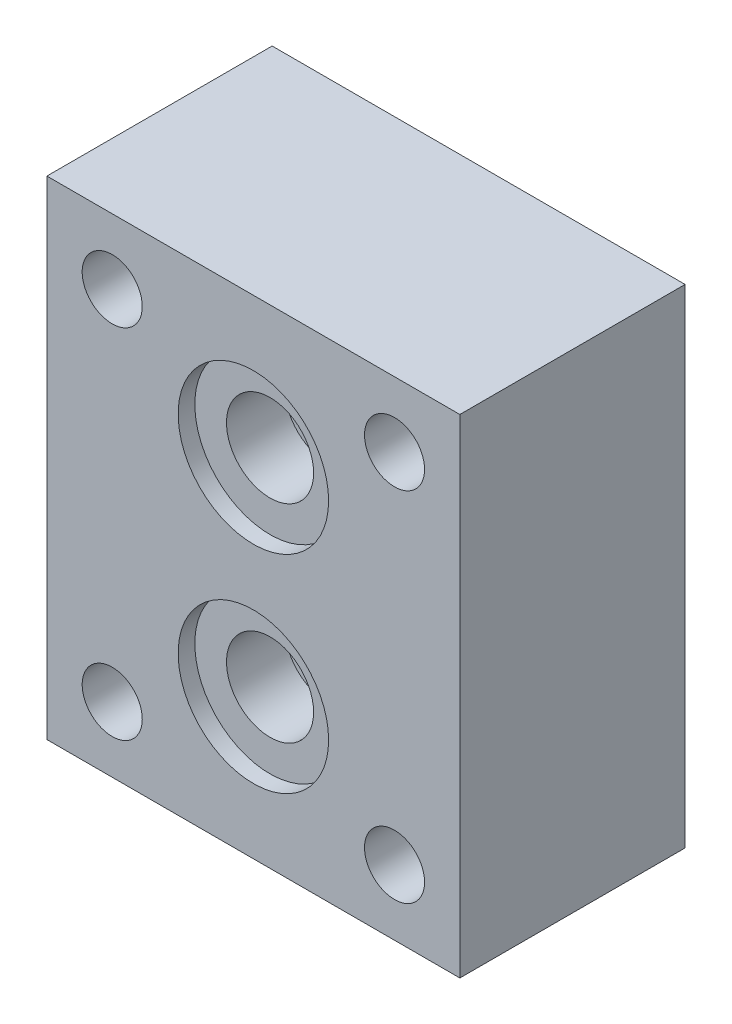
ISO-10303-21;
HEADER;
FILE_DESCRIPTION(('STEP AP214'),'2;1');
FILE_NAME('part.step','',(''),(''),'','','');
FILE_SCHEMA(('AUTOMOTIVE_DESIGN { 1 0 10303 214 1 1 1 1 }'));
ENDSEC;
DATA;
#1=APPLICATION_CONTEXT('core data for automotive mechanical design processes');
#2=APPLICATION_PROTOCOL_DEFINITION('international standard','automotive_design',2000,#1);
#3=PRODUCT_CONTEXT('',#1,'mechanical');
#4=PRODUCT('Part','Part','',(#3));
#5=PRODUCT_RELATED_PRODUCT_CATEGORY('part','',(#4));
#6=PRODUCT_DEFINITION_FORMATION('','',#4);
#7=PRODUCT_DEFINITION_CONTEXT('part definition',#1,'design');
#8=PRODUCT_DEFINITION('design','',#6,#7);
#9=PRODUCT_DEFINITION_SHAPE('','',#8);
#10=(LENGTH_UNIT() NAMED_UNIT(*) SI_UNIT(.MILLI.,.METRE.));
#11=(NAMED_UNIT(*) PLANE_ANGLE_UNIT() SI_UNIT($,.RADIAN.));
#12=(NAMED_UNIT(*) SI_UNIT($,.STERADIAN.) SOLID_ANGLE_UNIT());
#13=UNCERTAINTY_MEASURE_WITH_UNIT(LENGTH_MEASURE(1.E-05),#10,'distance_accuracy_value','');
#14=(GEOMETRIC_REPRESENTATION_CONTEXT(3) GLOBAL_UNCERTAINTY_ASSIGNED_CONTEXT((#13)) GLOBAL_UNIT_ASSIGNED_CONTEXT((#10,
#11,#12)) REPRESENTATION_CONTEXT('',''));
#15=CARTESIAN_POINT('',(0.,0.,0.));
#16=DIRECTION('',(0.,0.,1.));
#17=DIRECTION('',(1.,0.,0.));
#18=AXIS2_PLACEMENT_3D('',#15,#16,#17);
#19=CARTESIAN_POINT('',(34.925,41.275,19.05));
#20=DIRECTION('',(0.,-1.,0.));
#21=DIRECTION('',(0.,0.,-1.));
#22=AXIS2_PLACEMENT_3D('',#19,#20,#21);
#23=PLANE('',#22);
#24=DIRECTION('',(-1.,0.,0.));
#25=VECTOR('',#24,1.);
#26=CARTESIAN_POINT('',(34.925,41.275,-19.05));
#27=LINE('',#26,#25);
#28=CARTESIAN_POINT('',(34.925,41.275,-19.05));
#29=VERTEX_POINT('',#28);
#30=CARTESIAN_POINT('',(-34.925,41.275,-19.05));
#31=VERTEX_POINT('',#30);
#32=EDGE_CURVE('E109',#29,#31,#27,.T.);
#33=ORIENTED_EDGE('',*,*,#32,.T.);
#34=DIRECTION('',(0.,0.,-1.));
#35=VECTOR('',#34,1.);
#36=CARTESIAN_POINT('',(-34.925,41.275,19.05));
#37=LINE('',#36,#35);
#38=CARTESIAN_POINT('',(-34.925,41.275,19.05));
#39=VERTEX_POINT('',#38);
#40=EDGE_CURVE('E11',#39,#31,#37,.T.);
#41=ORIENTED_EDGE('',*,*,#40,.F.);
#42=DIRECTION('',(-1.,0.,0.));
#43=VECTOR('',#42,1.);
#44=CARTESIAN_POINT('',(34.925,41.275,19.05));
#45=LINE('',#44,#43);
#46=CARTESIAN_POINT('',(34.925,41.275,19.05));
#47=VERTEX_POINT('',#46);
#48=EDGE_CURVE('E96',#47,#39,#45,.T.);
#49=ORIENTED_EDGE('',*,*,#48,.F.);
#50=DIRECTION('',(0.,0.,-1.));
#51=VECTOR('',#50,1.);
#52=CARTESIAN_POINT('',(34.925,41.275,19.05));
#53=LINE('',#52,#51);
#54=EDGE_CURVE('E105',#47,#29,#53,.T.);
#55=ORIENTED_EDGE('',*,*,#54,.T.);
#56=EDGE_LOOP('',(#33,#41,#49,#55));
#57=FACE_BOUND('',#56,.T.);
#58=ADVANCED_FACE('F43',(#57),#23,.F.);
#59=CARTESIAN_POINT('',(-34.925,-41.275,19.05));
#60=DIRECTION('',(1.,0.,0.));
#61=DIRECTION('',(0.,0.,-1.));
#62=AXIS2_PLACEMENT_3D('',#59,#60,#61);
#63=PLANE('',#62);
#64=DIRECTION('',(0.,-1.,0.));
#65=VECTOR('',#64,1.);
#66=CARTESIAN_POINT('',(-34.925,-41.275,-19.05));
#67=LINE('',#66,#65);
#68=CARTESIAN_POINT('',(-34.925,-41.275,-19.05));
#69=VERTEX_POINT('',#68);
#70=EDGE_CURVE('E100',#31,#69,#67,.T.);
#71=ORIENTED_EDGE('',*,*,#70,.T.);
#72=DIRECTION('',(0.,0.,-1.));
#73=VECTOR('',#72,1.);
#74=CARTESIAN_POINT('',(-34.925,-41.275,19.05));
#75=LINE('',#74,#73);
#76=CARTESIAN_POINT('',(-34.925,-41.275,19.05));
#77=VERTEX_POINT('',#76);
#78=EDGE_CURVE('E52',#77,#69,#75,.T.);
#79=ORIENTED_EDGE('',*,*,#78,.F.);
#80=DIRECTION('',(0.,-1.,0.));
#81=VECTOR('',#80,1.);
#82=CARTESIAN_POINT('',(-34.925,-41.275,19.05));
#83=LINE('',#82,#81);
#84=EDGE_CURVE('E91',#39,#77,#83,.T.);
#85=ORIENTED_EDGE('',*,*,#84,.F.);
#86=ORIENTED_EDGE('',*,*,#40,.T.);
#87=EDGE_LOOP('',(#71,#79,#85,#86));
#88=FACE_BOUND('',#87,.T.);
#89=ADVANCED_FACE('F99',(#88),#63,.F.);
#90=CARTESIAN_POINT('',(34.925,-41.275,19.05));
#91=DIRECTION('',(0.,1.,0.));
#92=DIRECTION('',(0.,0.,1.));
#93=AXIS2_PLACEMENT_3D('',#90,#91,#92);
#94=PLANE('',#93);
#95=DIRECTION('',(1.,0.,0.));
#96=VECTOR('',#95,1.);
#97=CARTESIAN_POINT('',(34.925,-41.275,-19.05));
#98=LINE('',#97,#96);
#99=CARTESIAN_POINT('',(34.925,-41.275,-19.05));
#100=VERTEX_POINT('',#99);
#101=EDGE_CURVE('E78',#69,#100,#98,.T.);
#102=ORIENTED_EDGE('',*,*,#101,.T.);
#103=DIRECTION('',(0.,0.,-1.));
#104=VECTOR('',#103,1.);
#105=CARTESIAN_POINT('',(34.925,-41.275,19.05));
#106=LINE('',#105,#104);
#107=CARTESIAN_POINT('',(34.925,-41.275,19.05));
#108=VERTEX_POINT('',#107);
#109=EDGE_CURVE('E101',#108,#100,#106,.T.);
#110=ORIENTED_EDGE('',*,*,#109,.F.);
#111=DIRECTION('',(1.,0.,0.));
#112=VECTOR('',#111,1.);
#113=CARTESIAN_POINT('',(34.925,-41.275,19.05));
#114=LINE('',#113,#112);
#115=EDGE_CURVE('E94',#77,#108,#114,.T.);
#116=ORIENTED_EDGE('',*,*,#115,.F.);
#117=ORIENTED_EDGE('',*,*,#78,.T.);
#118=EDGE_LOOP('',(#102,#110,#116,#117));
#119=FACE_BOUND('',#118,.T.);
#120=ADVANCED_FACE('F103',(#119),#94,.F.);
#121=CARTESIAN_POINT('',(34.925,-41.275,19.05));
#122=DIRECTION('',(-1.,0.,0.));
#123=DIRECTION('',(0.,0.,1.));
#124=AXIS2_PLACEMENT_3D('',#121,#122,#123);
#125=PLANE('',#124);
#126=DIRECTION('',(0.,1.,0.));
#127=VECTOR('',#126,1.);
#128=CARTESIAN_POINT('',(34.925,-41.275,-19.05));
#129=LINE('',#128,#127);
#130=EDGE_CURVE('E84',#100,#29,#129,.T.);
#131=ORIENTED_EDGE('',*,*,#130,.T.);
#132=ORIENTED_EDGE('',*,*,#54,.F.);
#133=DIRECTION('',(0.,1.,0.));
#134=VECTOR('',#133,1.);
#135=CARTESIAN_POINT('',(34.925,-41.275,19.05));
#136=LINE('',#135,#134);
#137=EDGE_CURVE('E61',#108,#47,#136,.T.);
#138=ORIENTED_EDGE('',*,*,#137,.F.);
#139=ORIENTED_EDGE('',*,*,#109,.T.);
#140=EDGE_LOOP('',(#131,#132,#138,#139));
#141=FACE_BOUND('',#140,.T.);
#142=ADVANCED_FACE('F164',(#141),#125,.F.);
#143=CARTESIAN_POINT('',(0.,0.,19.05));
#144=DIRECTION('',(0.,0.,-1.));
#145=DIRECTION('',(-1.,0.,0.));
#146=AXIS2_PLACEMENT_3D('',#143,#144,#145);
#147=PLANE('',#146);
#148=CARTESIAN_POINT('',(0.,17.526,19.05));
#149=DIRECTION('',(0.,0.,1.));
#150=DIRECTION('',(1.,0.,0.));
#151=AXIS2_PLACEMENT_3D('',#148,#149,#150);
#152=CIRCLE('',#151,12.7254);
#153=CARTESIAN_POINT('',(12.7254,17.526,19.05));
#154=VERTEX_POINT('',#153);
#155=EDGE_CURVE('E316',#154,#154,#152,.T.);
#156=ORIENTED_EDGE('',*,*,#155,.F.);
#157=EDGE_LOOP('',(#156));
#158=FACE_BOUND('',#157,.T.);
#159=CARTESIAN_POINT('',(0.,-17.526,19.05));
#160=DIRECTION('',(0.,0.,1.));
#161=DIRECTION('',(1.,0.,0.));
#162=AXIS2_PLACEMENT_3D('',#159,#160,#161);
#163=CIRCLE('',#162,12.7254);
#164=CARTESIAN_POINT('',(12.7254,-17.526,19.05));
#165=VERTEX_POINT('',#164);
#166=EDGE_CURVE('E127',#165,#165,#163,.T.);
#167=ORIENTED_EDGE('',*,*,#166,.F.);
#168=EDGE_LOOP('',(#167));
#169=FACE_BOUND('',#168,.T.);
#170=CARTESIAN_POINT('',(23.876,30.226,19.05));
#171=DIRECTION('',(0.,0.,1.));
#172=DIRECTION('',(1.,0.,0.));
#173=AXIS2_PLACEMENT_3D('',#170,#171,#172);
#174=CIRCLE('',#173,5.08);
#175=CARTESIAN_POINT('',(28.956,30.226,19.05));
#176=VERTEX_POINT('',#175);
#177=EDGE_CURVE('E141',#176,#176,#174,.T.);
#178=ORIENTED_EDGE('',*,*,#177,.F.);
#179=EDGE_LOOP('',(#178));
#180=FACE_BOUND('',#179,.T.);
#181=CARTESIAN_POINT('',(-23.876,-30.226,19.05));
#182=DIRECTION('',(0.,0.,1.));
#183=DIRECTION('',(1.,0.,0.));
#184=AXIS2_PLACEMENT_3D('',#181,#182,#183);
#185=CIRCLE('',#184,5.08);
#186=CARTESIAN_POINT('',(-18.796,-30.226,19.05));
#187=VERTEX_POINT('',#186);
#188=EDGE_CURVE('E144',#187,#187,#185,.T.);
#189=ORIENTED_EDGE('',*,*,#188,.F.);
#190=EDGE_LOOP('',(#189));
#191=FACE_BOUND('',#190,.T.);
#192=CARTESIAN_POINT('',(-23.876,30.226,19.05));
#193=DIRECTION('',(0.,0.,1.));
#194=DIRECTION('',(1.,0.,0.));
#195=AXIS2_PLACEMENT_3D('',#192,#193,#194);
#196=CIRCLE('',#195,5.08);
#197=CARTESIAN_POINT('',(-18.796,30.226,19.05));
#198=VERTEX_POINT('',#197);
#199=EDGE_CURVE('E150',#198,#198,#196,.T.);
#200=ORIENTED_EDGE('',*,*,#199,.F.);
#201=EDGE_LOOP('',(#200));
#202=FACE_BOUND('',#201,.T.);
#203=CARTESIAN_POINT('',(23.876,-30.226,19.05));
#204=DIRECTION('',(0.,0.,1.));
#205=DIRECTION('',(1.,0.,0.));
#206=AXIS2_PLACEMENT_3D('',#203,#204,#205);
#207=CIRCLE('',#206,5.08);
#208=CARTESIAN_POINT('',(28.956,-30.226,19.05));
#209=VERTEX_POINT('',#208);
#210=EDGE_CURVE('E140',#209,#209,#207,.T.);
#211=ORIENTED_EDGE('',*,*,#210,.F.);
#212=EDGE_LOOP('',(#211));
#213=FACE_BOUND('',#212,.T.);
#214=ORIENTED_EDGE('',*,*,#48,.T.);
#215=ORIENTED_EDGE('',*,*,#84,.T.);
#216=ORIENTED_EDGE('',*,*,#115,.T.);
#217=ORIENTED_EDGE('',*,*,#137,.T.);
#218=EDGE_LOOP('',(#214,#215,#216,#217));
#219=FACE_BOUND('',#218,.T.);
#220=ADVANCED_FACE('F92',(#158,#169,#180,#191,#202,#213,#219),#147,.F.);
#221=CARTESIAN_POINT('',(0.,0.,-19.05));
#222=DIRECTION('',(0.,0.,-1.));
#223=DIRECTION('',(-1.,0.,0.));
#224=AXIS2_PLACEMENT_3D('',#221,#222,#223);
#225=PLANE('',#224);
#226=CARTESIAN_POINT('',(23.876,30.226,-19.05));
#227=DIRECTION('',(0.,0.,1.));
#228=DIRECTION('',(1.,0.,0.));
#229=AXIS2_PLACEMENT_3D('',#226,#227,#228);
#230=CIRCLE('',#229,5.08);
#231=CARTESIAN_POINT('',(28.956,30.226,-19.05));
#232=VERTEX_POINT('',#231);
#233=EDGE_CURVE('E137',#232,#232,#230,.T.);
#234=ORIENTED_EDGE('',*,*,#233,.T.);
#235=EDGE_LOOP('',(#234));
#236=FACE_BOUND('',#235,.T.);
#237=CARTESIAN_POINT('',(-23.876,-30.226,-19.05));
#238=DIRECTION('',(0.,0.,1.));
#239=DIRECTION('',(1.,0.,0.));
#240=AXIS2_PLACEMENT_3D('',#237,#238,#239);
#241=CIRCLE('',#240,5.08);
#242=CARTESIAN_POINT('',(-18.796,-30.226,-19.05));
#243=VERTEX_POINT('',#242);
#244=EDGE_CURVE('E147',#243,#243,#241,.T.);
#245=ORIENTED_EDGE('',*,*,#244,.T.);
#246=EDGE_LOOP('',(#245));
#247=FACE_BOUND('',#246,.T.);
#248=CARTESIAN_POINT('',(-23.876,30.226,-19.05));
#249=DIRECTION('',(0.,0.,1.));
#250=DIRECTION('',(1.,0.,0.));
#251=AXIS2_PLACEMENT_3D('',#248,#249,#250);
#252=CIRCLE('',#251,5.08);
#253=CARTESIAN_POINT('',(-18.796,30.226,-19.05));
#254=VERTEX_POINT('',#253);
#255=EDGE_CURVE('E124',#254,#254,#252,.T.);
#256=ORIENTED_EDGE('',*,*,#255,.T.);
#257=EDGE_LOOP('',(#256));
#258=FACE_BOUND('',#257,.T.);
#259=CARTESIAN_POINT('',(23.876,-30.226,-19.05));
#260=DIRECTION('',(0.,0.,1.));
#261=DIRECTION('',(1.,0.,0.));
#262=AXIS2_PLACEMENT_3D('',#259,#260,#261);
#263=CIRCLE('',#262,5.08);
#264=CARTESIAN_POINT('',(28.956,-30.226,-19.05));
#265=VERTEX_POINT('',#264);
#266=EDGE_CURVE('E112',#265,#265,#263,.T.);
#267=ORIENTED_EDGE('',*,*,#266,.T.);
#268=EDGE_LOOP('',(#267));
#269=FACE_BOUND('',#268,.T.);
#270=ORIENTED_EDGE('',*,*,#32,.F.);
#271=ORIENTED_EDGE('',*,*,#130,.F.);
#272=ORIENTED_EDGE('',*,*,#101,.F.);
#273=ORIENTED_EDGE('',*,*,#70,.F.);
#274=EDGE_LOOP('',(#270,#271,#272,#273));
#275=FACE_BOUND('',#274,.T.);
#276=ADVANCED_FACE('F163',(#236,#247,#258,#269,#275),#225,.T.);
#277=CARTESIAN_POINT('',(23.876,-30.226,-19.05));
#278=DIRECTION('',(0.,0.,1.));
#279=DIRECTION('',(1.,0.,0.));
#280=AXIS2_PLACEMENT_3D('',#277,#278,#279);
#281=CYLINDRICAL_SURFACE('',#280,5.08);
#282=ORIENTED_EDGE('',*,*,#266,.F.);
#283=EDGE_LOOP('',(#282));
#284=FACE_BOUND('',#283,.T.);
#285=ORIENTED_EDGE('',*,*,#210,.T.);
#286=EDGE_LOOP('',(#285));
#287=FACE_BOUND('',#286,.T.);
#288=ADVANCED_FACE('F160',(#284,#287),#281,.F.);
#289=CARTESIAN_POINT('',(-23.876,30.226,-19.05));
#290=DIRECTION('',(0.,0.,1.));
#291=DIRECTION('',(1.,0.,0.));
#292=AXIS2_PLACEMENT_3D('',#289,#290,#291);
#293=CYLINDRICAL_SURFACE('',#292,5.08);
#294=ORIENTED_EDGE('',*,*,#255,.F.);
#295=EDGE_LOOP('',(#294));
#296=FACE_BOUND('',#295,.T.);
#297=ORIENTED_EDGE('',*,*,#199,.T.);
#298=EDGE_LOOP('',(#297));
#299=FACE_BOUND('',#298,.T.);
#300=ADVANCED_FACE('F203',(#296,#299),#293,.F.);
#301=CARTESIAN_POINT('',(-23.876,-30.226,-19.05));
#302=DIRECTION('',(0.,0.,1.));
#303=DIRECTION('',(1.,0.,0.));
#304=AXIS2_PLACEMENT_3D('',#301,#302,#303);
#305=CYLINDRICAL_SURFACE('',#304,5.08);
#306=ORIENTED_EDGE('',*,*,#244,.F.);
#307=EDGE_LOOP('',(#306));
#308=FACE_BOUND('',#307,.T.);
#309=ORIENTED_EDGE('',*,*,#188,.T.);
#310=EDGE_LOOP('',(#309));
#311=FACE_BOUND('',#310,.T.);
#312=ADVANCED_FACE('F217',(#308,#311),#305,.F.);
#313=CARTESIAN_POINT('',(23.876,30.226,-19.05));
#314=DIRECTION('',(0.,0.,1.));
#315=DIRECTION('',(1.,0.,0.));
#316=AXIS2_PLACEMENT_3D('',#313,#314,#315);
#317=CYLINDRICAL_SURFACE('',#316,5.08);
#318=ORIENTED_EDGE('',*,*,#233,.F.);
#319=EDGE_LOOP('',(#318));
#320=FACE_BOUND('',#319,.T.);
#321=ORIENTED_EDGE('',*,*,#177,.T.);
#322=EDGE_LOOP('',(#321));
#323=FACE_BOUND('',#322,.T.);
#324=ADVANCED_FACE('F226',(#320,#323),#317,.F.);
#325=CARTESIAN_POINT('',(0.,-17.526,16.2306));
#326=DIRECTION('',(0.,0.,1.));
#327=DIRECTION('',(1.,0.,0.));
#328=AXIS2_PLACEMENT_3D('',#325,#326,#327);
#329=PLANE('',#328);
#330=CARTESIAN_POINT('',(0.,-17.526,16.2306));
#331=DIRECTION('',(0.,0.,1.));
#332=DIRECTION('',(1.,0.,0.));
#333=AXIS2_PLACEMENT_3D('',#330,#331,#332);
#334=CIRCLE('',#333,12.7254);
#335=CARTESIAN_POINT('',(12.7254,-17.526,16.2306));
#336=VERTEX_POINT('',#335);
#337=EDGE_CURVE('E120',#336,#336,#334,.T.);
#338=ORIENTED_EDGE('',*,*,#337,.T.);
#339=EDGE_LOOP('',(#338));
#340=FACE_BOUND('',#339,.T.);
#341=CARTESIAN_POINT('',(0.,-17.526,16.2306));
#342=DIRECTION('',(0.,0.,1.));
#343=DIRECTION('',(1.,0.,0.));
#344=AXIS2_PLACEMENT_3D('',#341,#342,#343);
#345=CIRCLE('',#344,7.366);
#346=CARTESIAN_POINT('',(7.366,-17.526,16.2306));
#347=VERTEX_POINT('',#346);
#348=EDGE_CURVE('E117',#347,#347,#345,.F.);
#349=ORIENTED_EDGE('',*,*,#348,.T.);
#350=EDGE_LOOP('',(#349));
#351=FACE_BOUND('',#350,.T.);
#352=ADVANCED_FACE('F235',(#340,#351),#329,.T.);
#353=CARTESIAN_POINT('',(0.,-17.526,16.2306));
#354=DIRECTION('',(0.,0.,1.));
#355=DIRECTION('',(1.,0.,0.));
#356=AXIS2_PLACEMENT_3D('',#353,#354,#355);
#357=CYLINDRICAL_SURFACE('',#356,12.7254);
#358=ORIENTED_EDGE('',*,*,#337,.F.);
#359=EDGE_LOOP('',(#358));
#360=FACE_BOUND('',#359,.T.);
#361=ORIENTED_EDGE('',*,*,#166,.T.);
#362=EDGE_LOOP('',(#361));
#363=FACE_BOUND('',#362,.T.);
#364=ADVANCED_FACE('F246',(#360,#363),#357,.F.);
#365=CARTESIAN_POINT('',(0.,-17.526,6.35));
#366=DIRECTION('',(0.,0.,1.));
#367=DIRECTION('',(1.,0.,0.));
#368=AXIS2_PLACEMENT_3D('',#365,#366,#367);
#369=PLANE('',#368);
#370=CARTESIAN_POINT('',(0.,-17.526,6.35));
#371=DIRECTION('',(0.,0.,1.));
#372=DIRECTION('',(1.,0.,0.));
#373=AXIS2_PLACEMENT_3D('',#370,#371,#372);
#374=CIRCLE('',#373,7.366);
#375=CARTESIAN_POINT('',(7.366,-17.526,6.35));
#376=VERTEX_POINT('',#375);
#377=EDGE_CURVE('E119',#376,#376,#374,.T.);
#378=ORIENTED_EDGE('',*,*,#377,.T.);
#379=EDGE_LOOP('',(#378));
#380=FACE_BOUND('',#379,.T.);
#381=ADVANCED_FACE('F242',(#380),#369,.T.);
#382=CARTESIAN_POINT('',(0.,-17.526,6.35));
#383=DIRECTION('',(0.,0.,1.));
#384=DIRECTION('',(1.,0.,0.));
#385=AXIS2_PLACEMENT_3D('',#382,#383,#384);
#386=CYLINDRICAL_SURFACE('',#385,7.366);
#387=ORIENTED_EDGE('',*,*,#377,.F.);
#388=EDGE_LOOP('',(#387));
#389=FACE_BOUND('',#388,.T.);
#390=ORIENTED_EDGE('',*,*,#348,.F.);
#391=EDGE_LOOP('',(#390));
#392=FACE_BOUND('',#391,.T.);
#393=ADVANCED_FACE('F245',(#389,#392),#386,.F.);
#394=CARTESIAN_POINT('',(0.,17.526,16.2306));
#395=DIRECTION('',(0.,0.,1.));
#396=DIRECTION('',(1.,0.,0.));
#397=AXIS2_PLACEMENT_3D('',#394,#395,#396);
#398=PLANE('',#397);
#399=CARTESIAN_POINT('',(0.,17.526,16.2306));
#400=DIRECTION('',(0.,0.,1.));
#401=DIRECTION('',(1.,0.,0.));
#402=AXIS2_PLACEMENT_3D('',#399,#400,#401);
#403=CIRCLE('',#402,12.7254);
#404=CARTESIAN_POINT('',(12.7254,17.526,16.2306));
#405=VERTEX_POINT('',#404);
#406=EDGE_CURVE('E314',#405,#405,#403,.T.);
#407=ORIENTED_EDGE('',*,*,#406,.T.);
#408=EDGE_LOOP('',(#407));
#409=FACE_BOUND('',#408,.T.);
#410=CARTESIAN_POINT('',(0.,17.526,16.2306));
#411=DIRECTION('',(0.,0.,1.));
#412=DIRECTION('',(1.,0.,0.));
#413=AXIS2_PLACEMENT_3D('',#410,#411,#412);
#414=CIRCLE('',#413,7.366);
#415=CARTESIAN_POINT('',(7.366,17.526,16.2306));
#416=VERTEX_POINT('',#415);
#417=EDGE_CURVE('E46',#416,#416,#414,.F.);
#418=ORIENTED_EDGE('',*,*,#417,.T.);
#419=EDGE_LOOP('',(#418));
#420=FACE_BOUND('',#419,.T.);
#421=ADVANCED_FACE('F271',(#409,#420),#398,.T.);
#422=CARTESIAN_POINT('',(0.,17.526,16.2306));
#423=DIRECTION('',(0.,0.,1.));
#424=DIRECTION('',(1.,0.,0.));
#425=AXIS2_PLACEMENT_3D('',#422,#423,#424);
#426=CYLINDRICAL_SURFACE('',#425,12.7254);
#427=ORIENTED_EDGE('',*,*,#406,.F.);
#428=EDGE_LOOP('',(#427));
#429=FACE_BOUND('',#428,.T.);
#430=ORIENTED_EDGE('',*,*,#155,.T.);
#431=EDGE_LOOP('',(#430));
#432=FACE_BOUND('',#431,.T.);
#433=ADVANCED_FACE('F278',(#429,#432),#426,.F.);
#434=CARTESIAN_POINT('',(0.,17.526,6.35));
#435=DIRECTION('',(0.,0.,1.));
#436=DIRECTION('',(1.,0.,0.));
#437=AXIS2_PLACEMENT_3D('',#434,#435,#436);
#438=PLANE('',#437);
#439=CARTESIAN_POINT('',(0.,17.526,6.35));
#440=DIRECTION('',(0.,0.,1.));
#441=DIRECTION('',(1.,0.,0.));
#442=AXIS2_PLACEMENT_3D('',#439,#440,#441);
#443=CIRCLE('',#442,7.366);
#444=CARTESIAN_POINT('',(7.366,17.526,6.35));
#445=VERTEX_POINT('',#444);
#446=EDGE_CURVE('E132',#445,#445,#443,.T.);
#447=ORIENTED_EDGE('',*,*,#446,.T.);
#448=EDGE_LOOP('',(#447));
#449=FACE_BOUND('',#448,.T.);
#450=ADVANCED_FACE('F275',(#449),#438,.T.);
#451=CARTESIAN_POINT('',(0.,17.526,6.35));
#452=DIRECTION('',(0.,0.,1.));
#453=DIRECTION('',(1.,0.,0.));
#454=AXIS2_PLACEMENT_3D('',#451,#452,#453);
#455=CYLINDRICAL_SURFACE('',#454,7.366);
#456=ORIENTED_EDGE('',*,*,#446,.F.);
#457=EDGE_LOOP('',(#456));
#458=FACE_BOUND('',#457,.T.);
#459=ORIENTED_EDGE('',*,*,#417,.F.);
#460=EDGE_LOOP('',(#459));
#461=FACE_BOUND('',#460,.T.);
#462=ADVANCED_FACE('F277',(#458,#461),#455,.F.);
#463=CLOSED_SHELL('',(#58,#89,#120,#142,#220,#276,#288,#300,#312,#324,#352,#364,#381,#393,#421,
#433,#450,#462));
#464=MANIFOLD_SOLID_BREP('B2',#463);
#465=ADVANCED_BREP_SHAPE_REPRESENTATION('',(#18,#464),#14);
#466=SHAPE_DEFINITION_REPRESENTATION(#9,#465);
ENDSEC;
END-ISO-10303-21;
